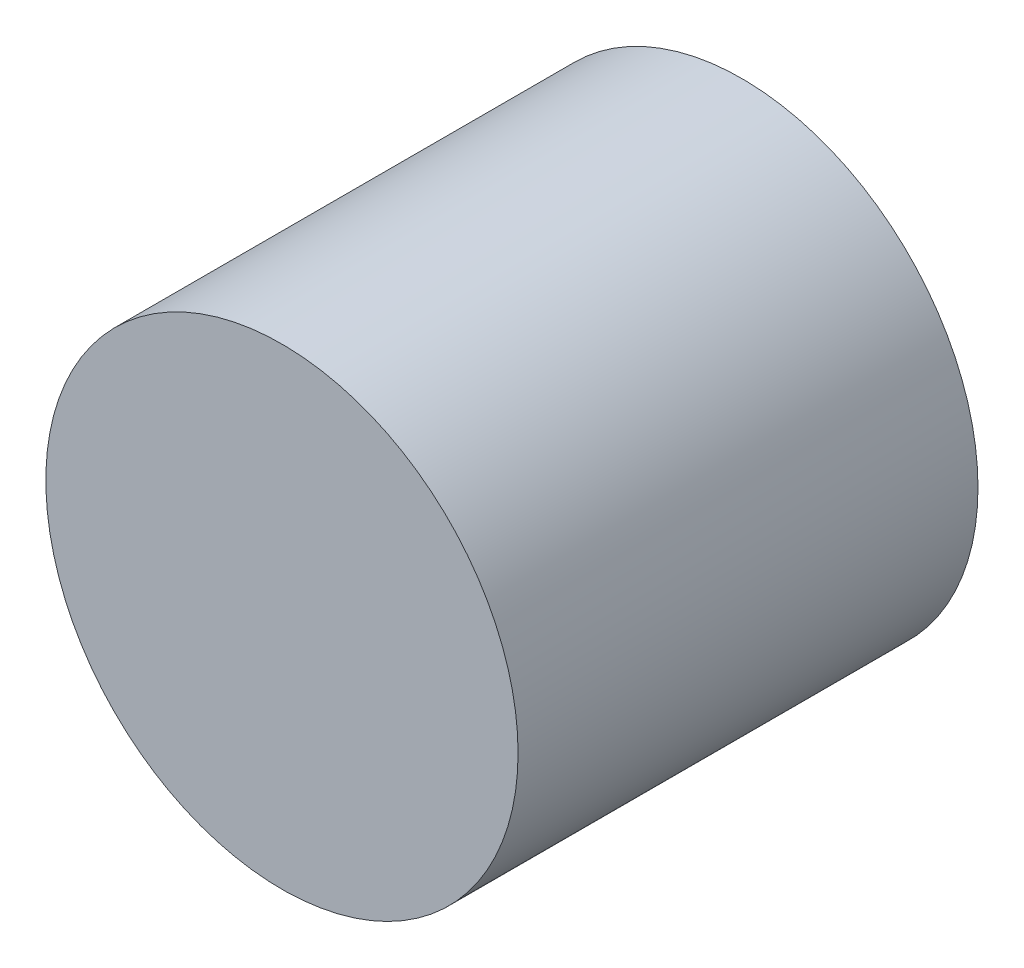
ISO-10303-21;
HEADER;
FILE_DESCRIPTION(('STEP AP214'),'2;1');
FILE_NAME('part.step','',(''),(''),'','','');
FILE_SCHEMA(('AUTOMOTIVE_DESIGN { 1 0 10303 214 1 1 1 1 }'));
ENDSEC;
DATA;
#1=APPLICATION_CONTEXT('core data for automotive mechanical design processes');
#2=APPLICATION_PROTOCOL_DEFINITION('international standard','automotive_design',2000,#1);
#3=PRODUCT_CONTEXT('',#1,'mechanical');
#4=PRODUCT('Part','Part','',(#3));
#5=PRODUCT_RELATED_PRODUCT_CATEGORY('part','',(#4));
#6=PRODUCT_DEFINITION_FORMATION('','',#4);
#7=PRODUCT_DEFINITION_CONTEXT('part definition',#1,'design');
#8=PRODUCT_DEFINITION('design','',#6,#7);
#9=PRODUCT_DEFINITION_SHAPE('','',#8);
#10=(LENGTH_UNIT() NAMED_UNIT(*) SI_UNIT(.MILLI.,.METRE.));
#11=(NAMED_UNIT(*) PLANE_ANGLE_UNIT() SI_UNIT($,.RADIAN.));
#12=(NAMED_UNIT(*) SI_UNIT($,.STERADIAN.) SOLID_ANGLE_UNIT());
#13=UNCERTAINTY_MEASURE_WITH_UNIT(LENGTH_MEASURE(1.E-05),#10,'distance_accuracy_value','');
#14=(GEOMETRIC_REPRESENTATION_CONTEXT(3) GLOBAL_UNCERTAINTY_ASSIGNED_CONTEXT((#13)) GLOBAL_UNIT_ASSIGNED_CONTEXT((#10,
#11,#12)) REPRESENTATION_CONTEXT('',''));
#15=CARTESIAN_POINT('',(0.,0.,0.));
#16=DIRECTION('',(0.,0.,1.));
#17=DIRECTION('',(1.,0.,0.));
#18=AXIS2_PLACEMENT_3D('',#15,#16,#17);
#19=CARTESIAN_POINT('',(0.,0.,-35.56));
#20=DIRECTION('',(0.,0.,1.));
#21=DIRECTION('',(1.,0.,0.));
#22=AXIS2_PLACEMENT_3D('',#19,#20,#21);
#23=PLANE('',#22);
#24=CARTESIAN_POINT('',(0.,0.,-35.56));
#25=DIRECTION('',(0.,0.,1.));
#26=DIRECTION('',(1.,0.,0.));
#27=AXIS2_PLACEMENT_3D('',#24,#25,#26);
#28=CIRCLE('',#27,18.25625);
#29=CARTESIAN_POINT('',(18.25625,0.,-35.56));
#30=VERTEX_POINT('',#29);
#31=EDGE_CURVE('E18',#30,#30,#28,.T.);
#32=ORIENTED_EDGE('',*,*,#31,.F.);
#33=EDGE_LOOP('',(#32));
#34=FACE_BOUND('',#33,.T.);
#35=ADVANCED_FACE('F15',(#34),#23,.F.);
#36=CARTESIAN_POINT('',(0.,0.,0.));
#37=DIRECTION('',(0.,0.,1.));
#38=DIRECTION('',(1.,0.,0.));
#39=AXIS2_PLACEMENT_3D('',#36,#37,#38);
#40=PLANE('',#39);
#41=CARTESIAN_POINT('',(0.,0.,0.));
#42=DIRECTION('',(0.,0.,1.));
#43=DIRECTION('',(1.,0.,0.));
#44=AXIS2_PLACEMENT_3D('',#41,#42,#43);
#45=CIRCLE('',#44,18.25625);
#46=CARTESIAN_POINT('',(18.25625,0.,0.));
#47=VERTEX_POINT('',#46);
#48=EDGE_CURVE('E10',#47,#47,#45,.F.);
#49=ORIENTED_EDGE('',*,*,#48,.F.);
#50=EDGE_LOOP('',(#49));
#51=FACE_BOUND('',#50,.T.);
#52=ADVANCED_FACE('F30',(#51),#40,.T.);
#53=CARTESIAN_POINT('',(0.,0.,-35.56));
#54=DIRECTION('',(0.,0.,1.));
#55=DIRECTION('',(1.,0.,0.));
#56=AXIS2_PLACEMENT_3D('',#53,#54,#55);
#57=CYLINDRICAL_SURFACE('',#56,18.25625);
#58=ORIENTED_EDGE('',*,*,#48,.T.);
#59=EDGE_LOOP('',(#58));
#60=FACE_BOUND('',#59,.T.);
#61=ORIENTED_EDGE('',*,*,#31,.T.);
#62=EDGE_LOOP('',(#61));
#63=FACE_BOUND('',#62,.T.);
#64=ADVANCED_FACE('F27',(#60,#63),#57,.T.);
#65=CLOSED_SHELL('',(#35,#52,#64));
#66=MANIFOLD_SOLID_BREP('B1',#65);
#67=ADVANCED_BREP_SHAPE_REPRESENTATION('',(#18,#66),#14);
#68=SHAPE_DEFINITION_REPRESENTATION(#9,#67);
ENDSEC;
END-ISO-10303-21;
